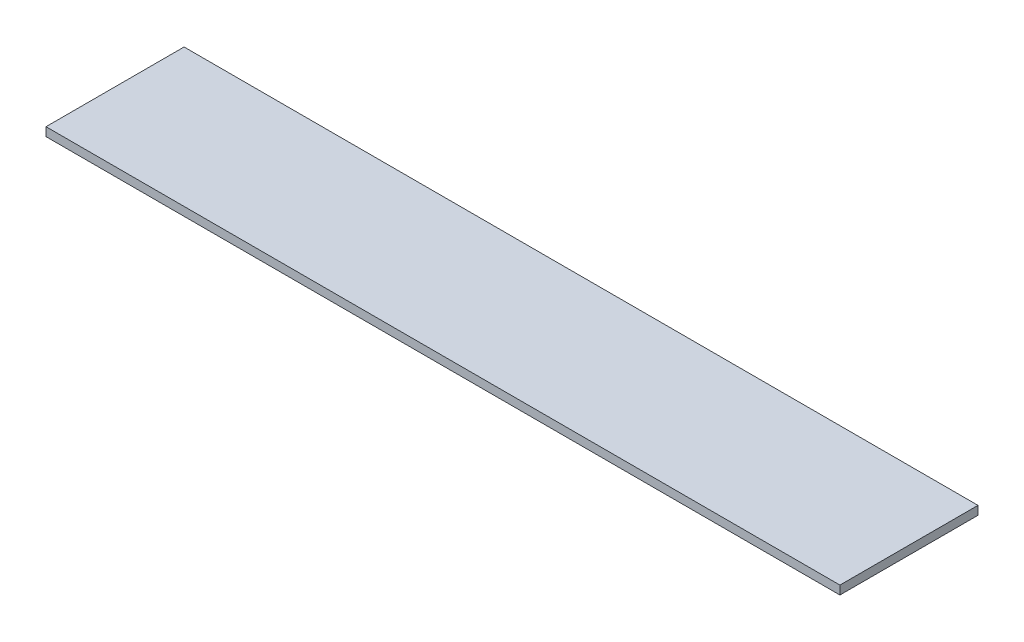
ISO-10303-21;
HEADER;
FILE_DESCRIPTION(('STEP AP214'),'2;1');
FILE_NAME('part.step','',(''),(''),'','','');
FILE_SCHEMA(('AUTOMOTIVE_DESIGN { 1 0 10303 214 1 1 1 1 }'));
ENDSEC;
DATA;
#1=APPLICATION_CONTEXT('core data for automotive mechanical design processes');
#2=APPLICATION_PROTOCOL_DEFINITION('international standard','automotive_design',2000,#1);
#3=PRODUCT_CONTEXT('',#1,'mechanical');
#4=PRODUCT('Part','Part','',(#3));
#5=PRODUCT_RELATED_PRODUCT_CATEGORY('part','',(#4));
#6=PRODUCT_DEFINITION_FORMATION('','',#4);
#7=PRODUCT_DEFINITION_CONTEXT('part definition',#1,'design');
#8=PRODUCT_DEFINITION('design','',#6,#7);
#9=PRODUCT_DEFINITION_SHAPE('','',#8);
#10=(LENGTH_UNIT() NAMED_UNIT(*) SI_UNIT(.MILLI.,.METRE.));
#11=(NAMED_UNIT(*) PLANE_ANGLE_UNIT() SI_UNIT($,.RADIAN.));
#12=(NAMED_UNIT(*) SI_UNIT($,.STERADIAN.) SOLID_ANGLE_UNIT());
#13=UNCERTAINTY_MEASURE_WITH_UNIT(LENGTH_MEASURE(1.E-05),#10,'distance_accuracy_value','');
#14=(GEOMETRIC_REPRESENTATION_CONTEXT(3) GLOBAL_UNCERTAINTY_ASSIGNED_CONTEXT((#13)) GLOBAL_UNIT_ASSIGNED_CONTEXT((#10,
#11,#12)) REPRESENTATION_CONTEXT('',''));
#15=CARTESIAN_POINT('',(0.,0.,0.));
#16=DIRECTION('',(0.,0.,1.));
#17=DIRECTION('',(1.,0.,0.));
#18=AXIS2_PLACEMENT_3D('',#15,#16,#17);
#19=CARTESIAN_POINT('',(0.,3.175,0.));
#20=DIRECTION('',(1.,0.,0.));
#21=DIRECTION('',(0.,0.,-1.));
#22=AXIS2_PLACEMENT_3D('',#19,#20,#21);
#23=PLANE('',#22);
#24=DIRECTION('',(0.,0.,1.));
#25=VECTOR('',#24,1.);
#26=CARTESIAN_POINT('',(0.,0.,0.));
#27=LINE('',#26,#25);
#28=CARTESIAN_POINT('',(0.,0.,0.));
#29=VERTEX_POINT('',#28);
#30=CARTESIAN_POINT('',(0.,0.,50.8));
#31=VERTEX_POINT('',#30);
#32=EDGE_CURVE('E96',#29,#31,#27,.T.);
#33=ORIENTED_EDGE('',*,*,#32,.T.);
#34=DIRECTION('',(0.,-1.,0.));
#35=VECTOR('',#34,1.);
#36=CARTESIAN_POINT('',(0.,3.175,50.8));
#37=LINE('',#36,#35);
#38=CARTESIAN_POINT('',(0.,3.175,50.8));
#39=VERTEX_POINT('',#38);
#40=EDGE_CURVE('E11',#39,#31,#37,.T.);
#41=ORIENTED_EDGE('',*,*,#40,.F.);
#42=DIRECTION('',(0.,0.,1.));
#43=VECTOR('',#42,1.);
#44=CARTESIAN_POINT('',(0.,3.175,0.));
#45=LINE('',#44,#43);
#46=CARTESIAN_POINT('',(0.,3.175,0.));
#47=VERTEX_POINT('',#46);
#48=EDGE_CURVE('E84',#47,#39,#45,.T.);
#49=ORIENTED_EDGE('',*,*,#48,.F.);
#50=DIRECTION('',(0.,-1.,0.));
#51=VECTOR('',#50,1.);
#52=CARTESIAN_POINT('',(0.,3.175,0.));
#53=LINE('',#52,#51);
#54=EDGE_CURVE('E92',#47,#29,#53,.T.);
#55=ORIENTED_EDGE('',*,*,#54,.T.);
#56=EDGE_LOOP('',(#33,#41,#49,#55));
#57=FACE_BOUND('',#56,.T.);
#58=ADVANCED_FACE('F33',(#57),#23,.F.);
#59=CARTESIAN_POINT('',(0.,3.175,50.8));
#60=DIRECTION('',(0.,0.,-1.));
#61=DIRECTION('',(-1.,0.,0.));
#62=AXIS2_PLACEMENT_3D('',#59,#60,#61);
#63=PLANE('',#62);
#64=DIRECTION('',(1.,0.,0.));
#65=VECTOR('',#64,1.);
#66=CARTESIAN_POINT('',(0.,0.,50.8));
#67=LINE('',#66,#65);
#68=CARTESIAN_POINT('',(292.1,0.,50.8));
#69=VERTEX_POINT('',#68);
#70=EDGE_CURVE('E88',#31,#69,#67,.T.);
#71=ORIENTED_EDGE('',*,*,#70,.T.);
#72=DIRECTION('',(0.,-1.,0.));
#73=VECTOR('',#72,1.);
#74=CARTESIAN_POINT('',(292.1,3.175,50.8));
#75=LINE('',#74,#73);
#76=CARTESIAN_POINT('',(292.1,3.175,50.8));
#77=VERTEX_POINT('',#76);
#78=EDGE_CURVE('E41',#77,#69,#75,.T.);
#79=ORIENTED_EDGE('',*,*,#78,.F.);
#80=DIRECTION('',(1.,0.,0.));
#81=VECTOR('',#80,1.);
#82=CARTESIAN_POINT('',(0.,3.175,50.8));
#83=LINE('',#82,#81);
#84=EDGE_CURVE('E79',#39,#77,#83,.T.);
#85=ORIENTED_EDGE('',*,*,#84,.F.);
#86=ORIENTED_EDGE('',*,*,#40,.T.);
#87=EDGE_LOOP('',(#71,#79,#85,#86));
#88=FACE_BOUND('',#87,.T.);
#89=ADVANCED_FACE('F87',(#88),#63,.F.);
#90=CARTESIAN_POINT('',(292.1,3.175,0.));
#91=DIRECTION('',(-1.,0.,0.));
#92=DIRECTION('',(0.,0.,1.));
#93=AXIS2_PLACEMENT_3D('',#90,#91,#92);
#94=PLANE('',#93);
#95=DIRECTION('',(0.,0.,-1.));
#96=VECTOR('',#95,1.);
#97=CARTESIAN_POINT('',(292.1,0.,0.));
#98=LINE('',#97,#96);
#99=CARTESIAN_POINT('',(292.1,0.,0.));
#100=VERTEX_POINT('',#99);
#101=EDGE_CURVE('E66',#69,#100,#98,.T.);
#102=ORIENTED_EDGE('',*,*,#101,.T.);
#103=DIRECTION('',(0.,-1.,0.));
#104=VECTOR('',#103,1.);
#105=CARTESIAN_POINT('',(292.1,3.175,0.));
#106=LINE('',#105,#104);
#107=CARTESIAN_POINT('',(292.1,3.175,0.));
#108=VERTEX_POINT('',#107);
#109=EDGE_CURVE('E89',#108,#100,#106,.T.);
#110=ORIENTED_EDGE('',*,*,#109,.F.);
#111=DIRECTION('',(0.,0.,-1.));
#112=VECTOR('',#111,1.);
#113=CARTESIAN_POINT('',(292.1,3.175,0.));
#114=LINE('',#113,#112);
#115=EDGE_CURVE('E82',#77,#108,#114,.T.);
#116=ORIENTED_EDGE('',*,*,#115,.F.);
#117=ORIENTED_EDGE('',*,*,#78,.T.);
#118=EDGE_LOOP('',(#102,#110,#116,#117));
#119=FACE_BOUND('',#118,.T.);
#120=ADVANCED_FACE('F90',(#119),#94,.F.);
#121=CARTESIAN_POINT('',(0.,3.175,0.));
#122=DIRECTION('',(0.,0.,1.));
#123=DIRECTION('',(1.,0.,0.));
#124=AXIS2_PLACEMENT_3D('',#121,#122,#123);
#125=PLANE('',#124);
#126=DIRECTION('',(-1.,0.,0.));
#127=VECTOR('',#126,1.);
#128=CARTESIAN_POINT('',(0.,0.,0.));
#129=LINE('',#128,#127);
#130=EDGE_CURVE('E72',#100,#29,#129,.T.);
#131=ORIENTED_EDGE('',*,*,#130,.T.);
#132=ORIENTED_EDGE('',*,*,#54,.F.);
#133=DIRECTION('',(-1.,0.,0.));
#134=VECTOR('',#133,1.);
#135=CARTESIAN_POINT('',(0.,3.175,0.));
#136=LINE('',#135,#134);
#137=EDGE_CURVE('E49',#108,#47,#136,.T.);
#138=ORIENTED_EDGE('',*,*,#137,.F.);
#139=ORIENTED_EDGE('',*,*,#109,.T.);
#140=EDGE_LOOP('',(#131,#132,#138,#139));
#141=FACE_BOUND('',#140,.T.);
#142=ADVANCED_FACE('F103',(#141),#125,.F.);
#143=CARTESIAN_POINT('',(0.,3.175,0.));
#144=DIRECTION('',(0.,1.,0.));
#145=DIRECTION('',(0.,0.,1.));
#146=AXIS2_PLACEMENT_3D('',#143,#144,#145);
#147=PLANE('',#146);
#148=ORIENTED_EDGE('',*,*,#48,.T.);
#149=ORIENTED_EDGE('',*,*,#84,.T.);
#150=ORIENTED_EDGE('',*,*,#115,.T.);
#151=ORIENTED_EDGE('',*,*,#137,.T.);
#152=EDGE_LOOP('',(#148,#149,#150,#151));
#153=FACE_BOUND('',#152,.T.);
#154=ADVANCED_FACE('F80',(#153),#147,.T.);
#155=CARTESIAN_POINT('',(0.,0.,0.));
#156=DIRECTION('',(0.,1.,0.));
#157=DIRECTION('',(0.,0.,1.));
#158=AXIS2_PLACEMENT_3D('',#155,#156,#157);
#159=PLANE('',#158);
#160=ORIENTED_EDGE('',*,*,#32,.F.);
#161=ORIENTED_EDGE('',*,*,#130,.F.);
#162=ORIENTED_EDGE('',*,*,#101,.F.);
#163=ORIENTED_EDGE('',*,*,#70,.F.);
#164=EDGE_LOOP('',(#160,#161,#162,#163));
#165=FACE_BOUND('',#164,.T.);
#166=ADVANCED_FACE('F106',(#165),#159,.F.);
#167=CLOSED_SHELL('',(#58,#89,#120,#142,#154,#166));
#168=MANIFOLD_SOLID_BREP('B2',#167);
#169=ADVANCED_BREP_SHAPE_REPRESENTATION('',(#18,#168),#14);
#170=SHAPE_DEFINITION_REPRESENTATION(#9,#169);
ENDSEC;
END-ISO-10303-21;
